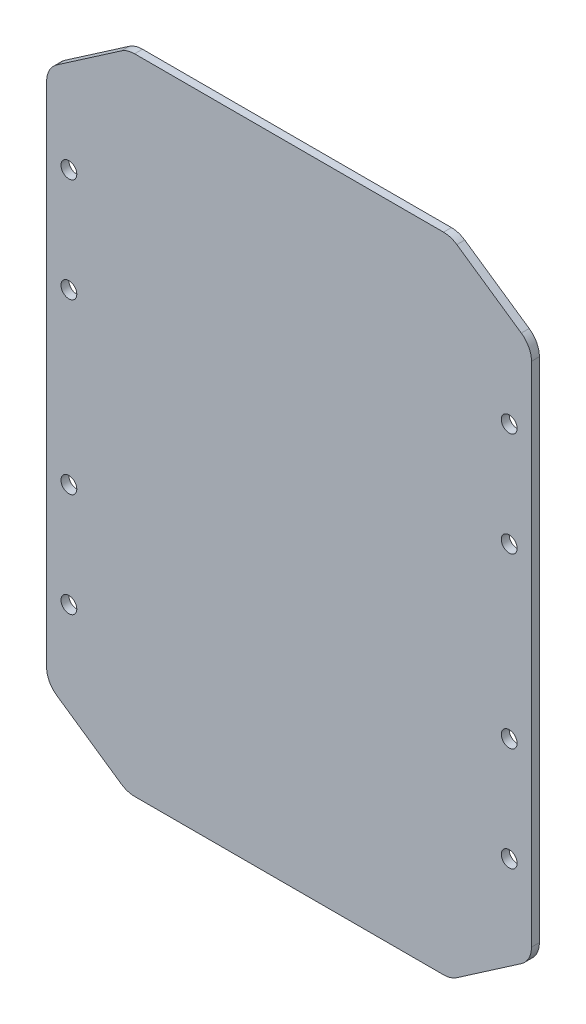
ISO-10303-21;
HEADER;
FILE_DESCRIPTION(('STEP AP214'),'2;1');
FILE_NAME('part.step','',(''),(''),'','','');
FILE_SCHEMA(('AUTOMOTIVE_DESIGN { 1 0 10303 214 1 1 1 1 }'));
ENDSEC;
DATA;
#1=APPLICATION_CONTEXT('core data for automotive mechanical design processes');
#2=APPLICATION_PROTOCOL_DEFINITION('international standard','automotive_design',2000,#1);
#3=PRODUCT_CONTEXT('',#1,'mechanical');
#4=PRODUCT('Part','Part','',(#3));
#5=PRODUCT_RELATED_PRODUCT_CATEGORY('part','',(#4));
#6=PRODUCT_DEFINITION_FORMATION('','',#4);
#7=PRODUCT_DEFINITION_CONTEXT('part definition',#1,'design');
#8=PRODUCT_DEFINITION('design','',#6,#7);
#9=PRODUCT_DEFINITION_SHAPE('','',#8);
#10=(LENGTH_UNIT() NAMED_UNIT(*) SI_UNIT(.MILLI.,.METRE.));
#11=(NAMED_UNIT(*) PLANE_ANGLE_UNIT() SI_UNIT($,.RADIAN.));
#12=(NAMED_UNIT(*) SI_UNIT($,.STERADIAN.) SOLID_ANGLE_UNIT());
#13=UNCERTAINTY_MEASURE_WITH_UNIT(LENGTH_MEASURE(1.E-05),#10,'distance_accuracy_value','');
#14=(GEOMETRIC_REPRESENTATION_CONTEXT(3) GLOBAL_UNCERTAINTY_ASSIGNED_CONTEXT((#13)) GLOBAL_UNIT_ASSIGNED_CONTEXT((#10,
#11,#12)) REPRESENTATION_CONTEXT('',''));
#15=CARTESIAN_POINT('',(0.,0.,0.));
#16=DIRECTION('',(0.,0.,1.));
#17=DIRECTION('',(1.,0.,0.));
#18=AXIS2_PLACEMENT_3D('',#15,#16,#17);
#19=CARTESIAN_POINT('',(40.8711702146889,-59.3739251689317,1.6));
#20=DIRECTION('',(-0.567014792889111,0.82370760870889,0.));
#21=DIRECTION('',(-0.82370760870889,-0.567014792889111,0.));
#22=AXIS2_PLACEMENT_3D('',#19,#20,#21);
#23=PLANE('',#22);
#24=DIRECTION('',(0.82370760870889,0.567014792889111,0.));
#25=VECTOR('',#24,1.);
#26=CARTESIAN_POINT('',(40.8711702146889,-59.3739251689317,0.));
#27=LINE('',#26,#25);
#28=CARTESIAN_POINT('',(33.9146020251458,-64.1626111413673,0.));
#29=VERTEX_POINT('',#28);
#30=CARTESIAN_POINT('',(46.9433202662233,-55.194045236465,0.));
#31=VERTEX_POINT('',#30);
#32=EDGE_CURVE('E206',#29,#31,#27,.T.);
#33=ORIENTED_EDGE('',*,*,#32,.T.);
#34=DIRECTION('',(0.,0.,-1.));
#35=VECTOR('',#34,1.);
#36=CARTESIAN_POINT('',(46.9433202662233,-55.194045236465,1.6));
#37=LINE('',#36,#35);
#38=CARTESIAN_POINT('',(46.9433202662233,-55.194045236465,1.6));
#39=VERTEX_POINT('',#38);
#40=EDGE_CURVE('E11',#39,#31,#37,.T.);
#41=ORIENTED_EDGE('',*,*,#40,.F.);
#42=DIRECTION('',(0.82370760870889,0.567014792889111,0.));
#43=VECTOR('',#42,1.);
#44=CARTESIAN_POINT('',(40.8711702146889,-59.3739251689317,1.6));
#45=LINE('',#44,#43);
#46=CARTESIAN_POINT('',(33.9146020251458,-64.1626111413673,1.6));
#47=VERTEX_POINT('',#46);
#48=EDGE_CURVE('E294',#47,#39,#45,.T.);
#49=ORIENTED_EDGE('',*,*,#48,.F.);
#50=DIRECTION('',(0.,0.,-1.));
#51=VECTOR('',#50,1.);
#52=CARTESIAN_POINT('',(33.9146020251458,-64.1626111413673,1.6));
#53=LINE('',#52,#51);
#54=EDGE_CURVE('E181',#47,#29,#53,.T.);
#55=ORIENTED_EDGE('',*,*,#54,.T.);
#56=EDGE_LOOP('',(#33,#41,#49,#55));
#57=FACE_BOUND('',#56,.T.);
#58=ADVANCED_FACE('F35',(#57),#23,.F.);
#59=CARTESIAN_POINT('',(44.25,-51.2814340950978,1.6));
#60=DIRECTION('',(0.,0.,-1.));
#61=DIRECTION('',(-1.,0.,0.));
#62=AXIS2_PLACEMENT_3D('',#59,#60,#61);
#63=CYLINDRICAL_SURFACE('',#62,4.75);
#64=CARTESIAN_POINT('',(44.25,-51.2814340950978,0.));
#65=DIRECTION('',(0.,0.,1.));
#66=DIRECTION('',(1.,0.,0.));
#67=AXIS2_PLACEMENT_3D('',#64,#65,#66);
#68=CIRCLE('',#67,4.75);
#69=CARTESIAN_POINT('',(49.,-51.2814340950978,0.));
#70=VERTEX_POINT('',#69);
#71=EDGE_CURVE('E209',#31,#70,#68,.T.);
#72=ORIENTED_EDGE('',*,*,#71,.T.);
#73=DIRECTION('',(0.,0.,-1.));
#74=VECTOR('',#73,1.);
#75=CARTESIAN_POINT('',(49.,-51.2814340950978,1.6));
#76=LINE('',#75,#74);
#77=CARTESIAN_POINT('',(49.,-51.2814340950978,1.6));
#78=VERTEX_POINT('',#77);
#79=EDGE_CURVE('E44',#78,#70,#76,.T.);
#80=ORIENTED_EDGE('',*,*,#79,.F.);
#81=CARTESIAN_POINT('',(44.25,-51.2814340950978,1.6));
#82=DIRECTION('',(0.,0.,1.));
#83=DIRECTION('',(1.,0.,0.));
#84=AXIS2_PLACEMENT_3D('',#81,#82,#83);
#85=CIRCLE('',#84,4.75);
#86=EDGE_CURVE('E118',#39,#78,#85,.T.);
#87=ORIENTED_EDGE('',*,*,#86,.F.);
#88=ORIENTED_EDGE('',*,*,#40,.T.);
#89=EDGE_LOOP('',(#72,#80,#87,#88));
#90=FACE_BOUND('',#89,.T.);
#91=ADVANCED_FACE('F277',(#90),#63,.T.);
#92=CARTESIAN_POINT('',(49.,0.,1.6));
#93=DIRECTION('',(1.,0.,0.));
#94=DIRECTION('',(0.,1.,0.));
#95=AXIS2_PLACEMENT_3D('',#92,#93,#94);
#96=PLANE('',#95);
#97=DIRECTION('',(0.,-1.,0.));
#98=VECTOR('',#97,1.);
#99=CARTESIAN_POINT('',(49.,0.,0.));
#100=LINE('',#99,#98);
#101=CARTESIAN_POINT('',(49.,51.2814340950978,0.));
#102=VERTEX_POINT('',#101);
#103=EDGE_CURVE('E212',#102,#70,#100,.T.);
#104=ORIENTED_EDGE('',*,*,#103,.F.);
#105=DIRECTION('',(0.,0.,-1.));
#106=VECTOR('',#105,1.);
#107=CARTESIAN_POINT('',(49.,51.2814340950978,1.6));
#108=LINE('',#107,#106);
#109=CARTESIAN_POINT('',(49.,51.2814340950978,1.6));
#110=VERTEX_POINT('',#109);
#111=EDGE_CURVE('E270',#110,#102,#108,.T.);
#112=ORIENTED_EDGE('',*,*,#111,.F.);
#113=DIRECTION('',(0.,-1.,0.));
#114=VECTOR('',#113,1.);
#115=CARTESIAN_POINT('',(49.,0.,1.6));
#116=LINE('',#115,#114);
#117=EDGE_CURVE('E276',#110,#78,#116,.T.);
#118=ORIENTED_EDGE('',*,*,#117,.T.);
#119=ORIENTED_EDGE('',*,*,#79,.T.);
#120=EDGE_LOOP('',(#104,#112,#118,#119));
#121=FACE_BOUND('',#120,.T.);
#122=ADVANCED_FACE('F274',(#121),#96,.T.);
#123=CARTESIAN_POINT('',(44.25,51.2814340950978,1.6));
#124=DIRECTION('',(0.,0.,-1.));
#125=DIRECTION('',(-1.,0.,0.));
#126=AXIS2_PLACEMENT_3D('',#123,#124,#125);
#127=CYLINDRICAL_SURFACE('',#126,4.75);
#128=CARTESIAN_POINT('',(44.25,51.2814340950978,0.));
#129=DIRECTION('',(0.,0.,1.));
#130=DIRECTION('',(1.,0.,0.));
#131=AXIS2_PLACEMENT_3D('',#128,#129,#130);
#132=CIRCLE('',#131,4.75);
#133=CARTESIAN_POINT('',(46.9433202662233,55.194045236465,0.));
#134=VERTEX_POINT('',#133);
#135=EDGE_CURVE('E215',#134,#102,#132,.F.);
#136=ORIENTED_EDGE('',*,*,#135,.F.);
#137=DIRECTION('',(0.,0.,-1.));
#138=VECTOR('',#137,1.);
#139=CARTESIAN_POINT('',(46.9433202662233,55.194045236465,1.6));
#140=LINE('',#139,#138);
#141=CARTESIAN_POINT('',(46.9433202662233,55.194045236465,1.6));
#142=VERTEX_POINT('',#141);
#143=EDGE_CURVE('E268',#142,#134,#140,.T.);
#144=ORIENTED_EDGE('',*,*,#143,.F.);
#145=CARTESIAN_POINT('',(44.25,51.2814340950978,1.6));
#146=DIRECTION('',(0.,0.,1.));
#147=DIRECTION('',(1.,0.,0.));
#148=AXIS2_PLACEMENT_3D('',#145,#146,#147);
#149=CIRCLE('',#148,4.75);
#150=EDGE_CURVE('E288',#142,#110,#149,.F.);
#151=ORIENTED_EDGE('',*,*,#150,.T.);
#152=ORIENTED_EDGE('',*,*,#111,.T.);
#153=EDGE_LOOP('',(#136,#144,#151,#152));
#154=FACE_BOUND('',#153,.T.);
#155=ADVANCED_FACE('F285',(#154),#127,.T.);
#156=CARTESIAN_POINT('',(40.8711702146889,59.3739251689317,1.6));
#157=DIRECTION('',(0.567014792889111,0.82370760870889,0.));
#158=DIRECTION('',(-0.82370760870889,0.567014792889111,0.));
#159=AXIS2_PLACEMENT_3D('',#156,#157,#158);
#160=PLANE('',#159);
#161=DIRECTION('',(0.82370760870889,-0.567014792889111,0.));
#162=VECTOR('',#161,1.);
#163=CARTESIAN_POINT('',(40.8711702146889,59.3739251689317,0.));
#164=LINE('',#163,#162);
#165=CARTESIAN_POINT('',(33.9146020251458,64.1626111413673,0.));
#166=VERTEX_POINT('',#165);
#167=EDGE_CURVE('E218',#166,#134,#164,.T.);
#168=ORIENTED_EDGE('',*,*,#167,.F.);
#169=DIRECTION('',(0.,0.,-1.));
#170=VECTOR('',#169,1.);
#171=CARTESIAN_POINT('',(33.9146020251458,64.1626111413673,1.6));
#172=LINE('',#171,#170);
#173=CARTESIAN_POINT('',(33.9146020251458,64.1626111413673,1.6));
#174=VERTEX_POINT('',#173);
#175=EDGE_CURVE('E266',#174,#166,#172,.T.);
#176=ORIENTED_EDGE('',*,*,#175,.F.);
#177=DIRECTION('',(0.82370760870889,-0.567014792889111,0.));
#178=VECTOR('',#177,1.);
#179=CARTESIAN_POINT('',(40.8711702146889,59.3739251689317,1.6));
#180=LINE('',#179,#178);
#181=EDGE_CURVE('E292',#174,#142,#180,.T.);
#182=ORIENTED_EDGE('',*,*,#181,.T.);
#183=ORIENTED_EDGE('',*,*,#143,.T.);
#184=EDGE_LOOP('',(#168,#176,#182,#183));
#185=FACE_BOUND('',#184,.T.);
#186=ADVANCED_FACE('F548',(#185),#160,.T.);
#187=CARTESIAN_POINT('',(31.2212817589226,60.25,1.6));
#188=DIRECTION('',(0.,0.,-1.));
#189=DIRECTION('',(-1.,0.,0.));
#190=AXIS2_PLACEMENT_3D('',#187,#188,#189);
#191=CYLINDRICAL_SURFACE('',#190,4.75);
#192=CARTESIAN_POINT('',(31.2212817589226,60.25,0.));
#193=DIRECTION('',(0.,0.,1.));
#194=DIRECTION('',(1.,0.,0.));
#195=AXIS2_PLACEMENT_3D('',#192,#193,#194);
#196=CIRCLE('',#195,4.75);
#197=CARTESIAN_POINT('',(31.2212817589226,65.,0.));
#198=VERTEX_POINT('',#197);
#199=EDGE_CURVE('E221',#198,#166,#196,.F.);
#200=ORIENTED_EDGE('',*,*,#199,.F.);
#201=DIRECTION('',(0.,0.,-1.));
#202=VECTOR('',#201,1.);
#203=CARTESIAN_POINT('',(31.2212817589226,65.,1.6));
#204=LINE('',#203,#202);
#205=CARTESIAN_POINT('',(31.2212817589226,65.,1.6));
#206=VERTEX_POINT('',#205);
#207=EDGE_CURVE('E264',#206,#198,#204,.T.);
#208=ORIENTED_EDGE('',*,*,#207,.F.);
#209=CARTESIAN_POINT('',(31.2212817589226,60.25,1.6));
#210=DIRECTION('',(0.,0.,1.));
#211=DIRECTION('',(1.,0.,0.));
#212=AXIS2_PLACEMENT_3D('',#209,#210,#211);
#213=CIRCLE('',#212,4.75);
#214=EDGE_CURVE('E299',#206,#174,#213,.F.);
#215=ORIENTED_EDGE('',*,*,#214,.T.);
#216=ORIENTED_EDGE('',*,*,#175,.T.);
#217=EDGE_LOOP('',(#200,#208,#215,#216));
#218=FACE_BOUND('',#217,.T.);
#219=ADVANCED_FACE('F538',(#218),#191,.T.);
#220=CARTESIAN_POINT('',(0.,65.,1.6));
#221=DIRECTION('',(0.,1.,0.));
#222=DIRECTION('',(0.,0.,1.));
#223=AXIS2_PLACEMENT_3D('',#220,#221,#222);
#224=PLANE('',#223);
#225=DIRECTION('',(1.,0.,0.));
#226=VECTOR('',#225,1.);
#227=CARTESIAN_POINT('',(0.,65.,0.));
#228=LINE('',#227,#226);
#229=CARTESIAN_POINT('',(-31.2212817589226,65.,0.));
#230=VERTEX_POINT('',#229);
#231=EDGE_CURVE('E224',#230,#198,#228,.T.);
#232=ORIENTED_EDGE('',*,*,#231,.F.);
#233=DIRECTION('',(0.,0.,-1.));
#234=VECTOR('',#233,1.);
#235=CARTESIAN_POINT('',(-31.2212817589226,65.,1.6));
#236=LINE('',#235,#234);
#237=CARTESIAN_POINT('',(-31.2212817589226,65.,1.6));
#238=VERTEX_POINT('',#237);
#239=EDGE_CURVE('E262',#238,#230,#236,.T.);
#240=ORIENTED_EDGE('',*,*,#239,.F.);
#241=DIRECTION('',(1.,0.,0.));
#242=VECTOR('',#241,1.);
#243=CARTESIAN_POINT('',(0.,65.,1.6));
#244=LINE('',#243,#242);
#245=EDGE_CURVE('E302',#238,#206,#244,.T.);
#246=ORIENTED_EDGE('',*,*,#245,.T.);
#247=ORIENTED_EDGE('',*,*,#207,.T.);
#248=EDGE_LOOP('',(#232,#240,#246,#247));
#249=FACE_BOUND('',#248,.T.);
#250=ADVANCED_FACE('F528',(#249),#224,.T.);
#251=CARTESIAN_POINT('',(-31.2212817589226,60.25,1.6));
#252=DIRECTION('',(0.,0.,-1.));
#253=DIRECTION('',(-1.,0.,0.));
#254=AXIS2_PLACEMENT_3D('',#251,#252,#253);
#255=CYLINDRICAL_SURFACE('',#254,4.75);
#256=CARTESIAN_POINT('',(-31.2212817589226,60.25,0.));
#257=DIRECTION('',(0.,0.,1.));
#258=DIRECTION('',(1.,0.,0.));
#259=AXIS2_PLACEMENT_3D('',#256,#257,#258);
#260=CIRCLE('',#259,4.75);
#261=CARTESIAN_POINT('',(-33.9146020251458,64.1626111413673,0.));
#262=VERTEX_POINT('',#261);
#263=EDGE_CURVE('E227',#230,#262,#260,.T.);
#264=ORIENTED_EDGE('',*,*,#263,.T.);
#265=DIRECTION('',(0.,0.,-1.));
#266=VECTOR('',#265,1.);
#267=CARTESIAN_POINT('',(-33.9146020251458,64.1626111413673,1.6));
#268=LINE('',#267,#266);
#269=CARTESIAN_POINT('',(-33.9146020251458,64.1626111413673,1.6));
#270=VERTEX_POINT('',#269);
#271=EDGE_CURVE('E259',#270,#262,#268,.T.);
#272=ORIENTED_EDGE('',*,*,#271,.F.);
#273=CARTESIAN_POINT('',(-31.2212817589226,60.25,1.6));
#274=DIRECTION('',(0.,0.,1.));
#275=DIRECTION('',(1.,0.,0.));
#276=AXIS2_PLACEMENT_3D('',#273,#274,#275);
#277=CIRCLE('',#276,4.75);
#278=EDGE_CURVE('E305',#238,#270,#277,.T.);
#279=ORIENTED_EDGE('',*,*,#278,.F.);
#280=ORIENTED_EDGE('',*,*,#239,.T.);
#281=EDGE_LOOP('',(#264,#272,#279,#280));
#282=FACE_BOUND('',#281,.T.);
#283=ADVANCED_FACE('F518',(#282),#255,.T.);
#284=CARTESIAN_POINT('',(-40.8711702146889,59.3739251689317,1.6));
#285=DIRECTION('',(0.567014792889111,-0.82370760870889,0.));
#286=DIRECTION('',(0.82370760870889,0.567014792889111,0.));
#287=AXIS2_PLACEMENT_3D('',#284,#285,#286);
#288=PLANE('',#287);
#289=DIRECTION('',(-0.82370760870889,-0.567014792889111,0.));
#290=VECTOR('',#289,1.);
#291=CARTESIAN_POINT('',(-40.8711702146889,59.3739251689317,0.));
#292=LINE('',#291,#290);
#293=CARTESIAN_POINT('',(-46.9433202662233,55.194045236465,0.));
#294=VERTEX_POINT('',#293);
#295=EDGE_CURVE('E229',#262,#294,#292,.T.);
#296=ORIENTED_EDGE('',*,*,#295,.T.);
#297=DIRECTION('',(0.,0.,-1.));
#298=VECTOR('',#297,1.);
#299=CARTESIAN_POINT('',(-46.9433202662233,55.194045236465,1.6));
#300=LINE('',#299,#298);
#301=CARTESIAN_POINT('',(-46.9433202662233,55.194045236465,1.6));
#302=VERTEX_POINT('',#301);
#303=EDGE_CURVE('E256',#302,#294,#300,.T.);
#304=ORIENTED_EDGE('',*,*,#303,.F.);
#305=DIRECTION('',(-0.82370760870889,-0.567014792889111,0.));
#306=VECTOR('',#305,1.);
#307=CARTESIAN_POINT('',(-40.8711702146889,59.3739251689317,1.6));
#308=LINE('',#307,#306);
#309=EDGE_CURVE('E307',#270,#302,#308,.T.);
#310=ORIENTED_EDGE('',*,*,#309,.F.);
#311=ORIENTED_EDGE('',*,*,#271,.T.);
#312=EDGE_LOOP('',(#296,#304,#310,#311));
#313=FACE_BOUND('',#312,.T.);
#314=ADVANCED_FACE('F508',(#313),#288,.F.);
#315=CARTESIAN_POINT('',(-44.25,51.2814340950978,1.6));
#316=DIRECTION('',(0.,0.,-1.));
#317=DIRECTION('',(-1.,0.,0.));
#318=AXIS2_PLACEMENT_3D('',#315,#316,#317);
#319=CYLINDRICAL_SURFACE('',#318,4.75);
#320=CARTESIAN_POINT('',(-44.25,51.2814340950978,0.));
#321=DIRECTION('',(0.,0.,1.));
#322=DIRECTION('',(1.,0.,0.));
#323=AXIS2_PLACEMENT_3D('',#320,#321,#322);
#324=CIRCLE('',#323,4.75);
#325=CARTESIAN_POINT('',(-49.,51.2814340950978,0.));
#326=VERTEX_POINT('',#325);
#327=EDGE_CURVE('E231',#294,#326,#324,.T.);
#328=ORIENTED_EDGE('',*,*,#327,.T.);
#329=DIRECTION('',(0.,0.,-1.));
#330=VECTOR('',#329,1.);
#331=CARTESIAN_POINT('',(-49.,51.2814340950978,1.6));
#332=LINE('',#331,#330);
#333=CARTESIAN_POINT('',(-49.,51.2814340950978,1.6));
#334=VERTEX_POINT('',#333);
#335=EDGE_CURVE('E253',#334,#326,#332,.T.);
#336=ORIENTED_EDGE('',*,*,#335,.F.);
#337=CARTESIAN_POINT('',(-44.25,51.2814340950978,1.6));
#338=DIRECTION('',(0.,0.,1.));
#339=DIRECTION('',(1.,0.,0.));
#340=AXIS2_PLACEMENT_3D('',#337,#338,#339);
#341=CIRCLE('',#340,4.75);
#342=EDGE_CURVE('E309',#302,#334,#341,.T.);
#343=ORIENTED_EDGE('',*,*,#342,.F.);
#344=ORIENTED_EDGE('',*,*,#303,.T.);
#345=EDGE_LOOP('',(#328,#336,#343,#344));
#346=FACE_BOUND('',#345,.T.);
#347=ADVANCED_FACE('F498',(#346),#319,.T.);
#348=CARTESIAN_POINT('',(-49.,0.,1.6));
#349=DIRECTION('',(1.,0.,0.));
#350=DIRECTION('',(0.,0.,-1.));
#351=AXIS2_PLACEMENT_3D('',#348,#349,#350);
#352=PLANE('',#351);
#353=DIRECTION('',(0.,-1.,0.));
#354=VECTOR('',#353,1.);
#355=CARTESIAN_POINT('',(-49.,0.,0.));
#356=LINE('',#355,#354);
#357=CARTESIAN_POINT('',(-49.,-51.2814340950978,0.));
#358=VERTEX_POINT('',#357);
#359=EDGE_CURVE('E233',#326,#358,#356,.T.);
#360=ORIENTED_EDGE('',*,*,#359,.T.);
#361=DIRECTION('',(0.,0.,-1.));
#362=VECTOR('',#361,1.);
#363=CARTESIAN_POINT('',(-49.,-51.2814340950978,1.6));
#364=LINE('',#363,#362);
#365=CARTESIAN_POINT('',(-49.,-51.2814340950978,1.6));
#366=VERTEX_POINT('',#365);
#367=EDGE_CURVE('E251',#366,#358,#364,.T.);
#368=ORIENTED_EDGE('',*,*,#367,.F.);
#369=DIRECTION('',(0.,-1.,0.));
#370=VECTOR('',#369,1.);
#371=CARTESIAN_POINT('',(-49.,0.,1.6));
#372=LINE('',#371,#370);
#373=EDGE_CURVE('E311',#334,#366,#372,.T.);
#374=ORIENTED_EDGE('',*,*,#373,.F.);
#375=ORIENTED_EDGE('',*,*,#335,.T.);
#376=EDGE_LOOP('',(#360,#368,#374,#375));
#377=FACE_BOUND('',#376,.T.);
#378=ADVANCED_FACE('F489',(#377),#352,.F.);
#379=CARTESIAN_POINT('',(-44.25,-51.2814340950978,1.6));
#380=DIRECTION('',(0.,0.,-1.));
#381=DIRECTION('',(-1.,0.,0.));
#382=AXIS2_PLACEMENT_3D('',#379,#380,#381);
#383=CYLINDRICAL_SURFACE('',#382,4.75);
#384=CARTESIAN_POINT('',(-44.25,-51.2814340950978,0.));
#385=DIRECTION('',(0.,0.,1.));
#386=DIRECTION('',(1.,0.,0.));
#387=AXIS2_PLACEMENT_3D('',#384,#385,#386);
#388=CIRCLE('',#387,4.75);
#389=CARTESIAN_POINT('',(-46.9433202662233,-55.194045236465,0.));
#390=VERTEX_POINT('',#389);
#391=EDGE_CURVE('E236',#390,#358,#388,.F.);
#392=ORIENTED_EDGE('',*,*,#391,.F.);
#393=DIRECTION('',(0.,0.,-1.));
#394=VECTOR('',#393,1.);
#395=CARTESIAN_POINT('',(-46.9433202662233,-55.194045236465,1.6));
#396=LINE('',#395,#394);
#397=CARTESIAN_POINT('',(-46.9433202662233,-55.194045236465,1.6));
#398=VERTEX_POINT('',#397);
#399=EDGE_CURVE('E249',#398,#390,#396,.T.);
#400=ORIENTED_EDGE('',*,*,#399,.F.);
#401=CARTESIAN_POINT('',(-44.25,-51.2814340950978,1.6));
#402=DIRECTION('',(0.,0.,1.));
#403=DIRECTION('',(1.,0.,0.));
#404=AXIS2_PLACEMENT_3D('',#401,#402,#403);
#405=CIRCLE('',#404,4.75);
#406=EDGE_CURVE('E176',#398,#366,#405,.F.);
#407=ORIENTED_EDGE('',*,*,#406,.T.);
#408=ORIENTED_EDGE('',*,*,#367,.T.);
#409=EDGE_LOOP('',(#392,#400,#407,#408));
#410=FACE_BOUND('',#409,.T.);
#411=ADVANCED_FACE('F315',(#410),#383,.T.);
#412=CARTESIAN_POINT('',(-40.8711702146889,-59.3739251689317,1.6));
#413=DIRECTION('',(-0.567014792889111,-0.82370760870889,0.));
#414=DIRECTION('',(0.82370760870889,-0.567014792889111,0.));
#415=AXIS2_PLACEMENT_3D('',#412,#413,#414);
#416=PLANE('',#415);
#417=DIRECTION('',(-0.82370760870889,0.567014792889111,0.));
#418=VECTOR('',#417,1.);
#419=CARTESIAN_POINT('',(-40.8711702146889,-59.3739251689317,0.));
#420=LINE('',#419,#418);
#421=CARTESIAN_POINT('',(-33.9146020251458,-64.1626111413673,0.));
#422=VERTEX_POINT('',#421);
#423=EDGE_CURVE('E239',#422,#390,#420,.T.);
#424=ORIENTED_EDGE('',*,*,#423,.F.);
#425=DIRECTION('',(0.,0.,-1.));
#426=VECTOR('',#425,1.);
#427=CARTESIAN_POINT('',(-33.9146020251458,-64.1626111413673,1.6));
#428=LINE('',#427,#426);
#429=CARTESIAN_POINT('',(-33.9146020251458,-64.1626111413673,1.6));
#430=VERTEX_POINT('',#429);
#431=EDGE_CURVE('E164',#430,#422,#428,.T.);
#432=ORIENTED_EDGE('',*,*,#431,.F.);
#433=DIRECTION('',(-0.82370760870889,0.567014792889111,0.));
#434=VECTOR('',#433,1.);
#435=CARTESIAN_POINT('',(-40.8711702146889,-59.3739251689317,1.6));
#436=LINE('',#435,#434);
#437=EDGE_CURVE('E174',#430,#398,#436,.T.);
#438=ORIENTED_EDGE('',*,*,#437,.T.);
#439=ORIENTED_EDGE('',*,*,#399,.T.);
#440=EDGE_LOOP('',(#424,#432,#438,#439));
#441=FACE_BOUND('',#440,.T.);
#442=ADVANCED_FACE('F320',(#441),#416,.T.);
#443=CARTESIAN_POINT('',(-31.2212817589226,-60.25,1.6));
#444=DIRECTION('',(0.,0.,-1.));
#445=DIRECTION('',(-1.,0.,0.));
#446=AXIS2_PLACEMENT_3D('',#443,#444,#445);
#447=CYLINDRICAL_SURFACE('',#446,4.75);
#448=CARTESIAN_POINT('',(-31.2212817589226,-60.25,0.));
#449=DIRECTION('',(0.,0.,1.));
#450=DIRECTION('',(1.,0.,0.));
#451=AXIS2_PLACEMENT_3D('',#448,#449,#450);
#452=CIRCLE('',#451,4.75);
#453=CARTESIAN_POINT('',(-31.2212817589226,-65.,0.));
#454=VERTEX_POINT('',#453);
#455=EDGE_CURVE('E163',#454,#422,#452,.F.);
#456=ORIENTED_EDGE('',*,*,#455,.F.);
#457=DIRECTION('',(0.,0.,-1.));
#458=VECTOR('',#457,1.);
#459=CARTESIAN_POINT('',(-31.2212817589226,-65.,1.6));
#460=LINE('',#459,#458);
#461=CARTESIAN_POINT('',(-31.2212817589226,-65.,1.6));
#462=VERTEX_POINT('',#461);
#463=EDGE_CURVE('E157',#462,#454,#460,.T.);
#464=ORIENTED_EDGE('',*,*,#463,.F.);
#465=CARTESIAN_POINT('',(-31.2212817589226,-60.25,1.6));
#466=DIRECTION('',(0.,0.,1.));
#467=DIRECTION('',(1.,0.,0.));
#468=AXIS2_PLACEMENT_3D('',#465,#466,#467);
#469=CIRCLE('',#468,4.75);
#470=EDGE_CURVE('E161',#462,#430,#469,.F.);
#471=ORIENTED_EDGE('',*,*,#470,.T.);
#472=ORIENTED_EDGE('',*,*,#431,.T.);
#473=EDGE_LOOP('',(#456,#464,#471,#472));
#474=FACE_BOUND('',#473,.T.);
#475=ADVANCED_FACE('F159',(#474),#447,.T.);
#476=CARTESIAN_POINT('',(0.,-65.,1.6));
#477=DIRECTION('',(0.,1.,0.));
#478=DIRECTION('',(0.,0.,1.));
#479=AXIS2_PLACEMENT_3D('',#476,#477,#478);
#480=PLANE('',#479);
#481=DIRECTION('',(1.,0.,0.));
#482=VECTOR('',#481,1.);
#483=CARTESIAN_POINT('',(0.,-65.,0.));
#484=LINE('',#483,#482);
#485=CARTESIAN_POINT('',(31.2212817589226,-65.,0.));
#486=VERTEX_POINT('',#485);
#487=EDGE_CURVE('E104',#454,#486,#484,.T.);
#488=ORIENTED_EDGE('',*,*,#487,.T.);
#489=DIRECTION('',(0.,0.,-1.));
#490=VECTOR('',#489,1.);
#491=CARTESIAN_POINT('',(31.2212817589226,-65.,1.6));
#492=LINE('',#491,#490);
#493=CARTESIAN_POINT('',(31.2212817589226,-65.,1.6));
#494=VERTEX_POINT('',#493);
#495=EDGE_CURVE('E165',#494,#486,#492,.T.);
#496=ORIENTED_EDGE('',*,*,#495,.F.);
#497=DIRECTION('',(1.,0.,0.));
#498=VECTOR('',#497,1.);
#499=CARTESIAN_POINT('',(0.,-65.,1.6));
#500=LINE('',#499,#498);
#501=EDGE_CURVE('E167',#462,#494,#500,.T.);
#502=ORIENTED_EDGE('',*,*,#501,.F.);
#503=ORIENTED_EDGE('',*,*,#463,.T.);
#504=EDGE_LOOP('',(#488,#496,#502,#503));
#505=FACE_BOUND('',#504,.T.);
#506=ADVANCED_FACE('F168',(#505),#480,.F.);
#507=CARTESIAN_POINT('',(44.5,38.0565096031517,1.6));
#508=DIRECTION('',(0.,0.,-1.));
#509=DIRECTION('',(-1.,0.,0.));
#510=AXIS2_PLACEMENT_3D('',#507,#508,#509);
#511=CYLINDRICAL_SURFACE('',#510,1.6);
#512=CARTESIAN_POINT('',(44.5,38.0565096031517,1.6));
#513=DIRECTION('',(0.,0.,1.));
#514=DIRECTION('',(1.,0.,0.));
#515=AXIS2_PLACEMENT_3D('',#512,#513,#514);
#516=CIRCLE('',#515,1.6);
#517=CARTESIAN_POINT('',(46.1,38.0565096031517,1.6));
#518=VERTEX_POINT('',#517);
#519=EDGE_CURVE('E627',#518,#518,#516,.F.);
#520=ORIENTED_EDGE('',*,*,#519,.F.);
#521=EDGE_LOOP('',(#520));
#522=FACE_BOUND('',#521,.T.);
#523=CARTESIAN_POINT('',(44.5,38.0565096031517,0.));
#524=DIRECTION('',(0.,0.,1.));
#525=DIRECTION('',(1.,0.,0.));
#526=AXIS2_PLACEMENT_3D('',#523,#524,#525);
#527=CIRCLE('',#526,1.6);
#528=CARTESIAN_POINT('',(46.1,38.0565096031517,0.));
#529=VERTEX_POINT('',#528);
#530=EDGE_CURVE('E203',#529,#529,#527,.F.);
#531=ORIENTED_EDGE('',*,*,#530,.T.);
#532=EDGE_LOOP('',(#531));
#533=FACE_BOUND('',#532,.T.);
#534=ADVANCED_FACE('F344',(#522,#533),#511,.F.);
#535=CARTESIAN_POINT('',(44.5,-38.0565096031517,1.6));
#536=DIRECTION('',(0.,0.,-1.));
#537=DIRECTION('',(-1.,0.,0.));
#538=AXIS2_PLACEMENT_3D('',#535,#536,#537);
#539=CYLINDRICAL_SURFACE('',#538,1.6);
#540=CARTESIAN_POINT('',(44.5,-38.0565096031517,1.6));
#541=DIRECTION('',(0.,0.,1.));
#542=DIRECTION('',(1.,0.,0.));
#543=AXIS2_PLACEMENT_3D('',#540,#541,#542);
#544=CIRCLE('',#543,1.6);
#545=CARTESIAN_POINT('',(46.1,-38.0565096031517,1.6));
#546=VERTEX_POINT('',#545);
#547=EDGE_CURVE('E624',#546,#546,#544,.T.);
#548=ORIENTED_EDGE('',*,*,#547,.T.);
#549=EDGE_LOOP('',(#548));
#550=FACE_BOUND('',#549,.T.);
#551=CARTESIAN_POINT('',(44.5,-38.0565096031517,0.));
#552=DIRECTION('',(0.,0.,1.));
#553=DIRECTION('',(1.,0.,0.));
#554=AXIS2_PLACEMENT_3D('',#551,#552,#553);
#555=CIRCLE('',#554,1.6);
#556=CARTESIAN_POINT('',(46.1,-38.0565096031517,0.));
#557=VERTEX_POINT('',#556);
#558=EDGE_CURVE('E200',#557,#557,#555,.T.);
#559=ORIENTED_EDGE('',*,*,#558,.F.);
#560=EDGE_LOOP('',(#559));
#561=FACE_BOUND('',#560,.T.);
#562=ADVANCED_FACE('F347',(#550,#561),#539,.F.);
#563=CARTESIAN_POINT('',(44.5,-17.0565096031518,1.6));
#564=DIRECTION('',(0.,0.,-1.));
#565=DIRECTION('',(-1.,0.,0.));
#566=AXIS2_PLACEMENT_3D('',#563,#564,#565);
#567=CYLINDRICAL_SURFACE('',#566,1.6);
#568=CARTESIAN_POINT('',(44.5,-17.0565096031518,1.6));
#569=DIRECTION('',(0.,0.,1.));
#570=DIRECTION('',(1.,0.,0.));
#571=AXIS2_PLACEMENT_3D('',#568,#569,#570);
#572=CIRCLE('',#571,1.6);
#573=CARTESIAN_POINT('',(46.1,-17.0565096031518,1.6));
#574=VERTEX_POINT('',#573);
#575=EDGE_CURVE('E621',#574,#574,#572,.T.);
#576=ORIENTED_EDGE('',*,*,#575,.T.);
#577=EDGE_LOOP('',(#576));
#578=FACE_BOUND('',#577,.T.);
#579=CARTESIAN_POINT('',(44.5,-17.0565096031518,0.));
#580=DIRECTION('',(0.,0.,1.));
#581=DIRECTION('',(1.,0.,0.));
#582=AXIS2_PLACEMENT_3D('',#579,#580,#581);
#583=CIRCLE('',#582,1.6);
#584=CARTESIAN_POINT('',(46.1,-17.0565096031518,0.));
#585=VERTEX_POINT('',#584);
#586=EDGE_CURVE('E197',#585,#585,#583,.T.);
#587=ORIENTED_EDGE('',*,*,#586,.F.);
#588=EDGE_LOOP('',(#587));
#589=FACE_BOUND('',#588,.T.);
#590=ADVANCED_FACE('F351',(#578,#589),#567,.F.);
#591=CARTESIAN_POINT('',(-44.5,-38.0565096031517,1.6));
#592=DIRECTION('',(0.,0.,-1.));
#593=DIRECTION('',(-1.,0.,0.));
#594=AXIS2_PLACEMENT_3D('',#591,#592,#593);
#595=CYLINDRICAL_SURFACE('',#594,1.6);
#596=CARTESIAN_POINT('',(-44.5,-38.0565096031517,1.6));
#597=DIRECTION('',(0.,0.,1.));
#598=DIRECTION('',(1.,0.,0.));
#599=AXIS2_PLACEMENT_3D('',#596,#597,#598);
#600=CIRCLE('',#599,1.6);
#601=CARTESIAN_POINT('',(-42.9,-38.0565096031517,1.6));
#602=VERTEX_POINT('',#601);
#603=EDGE_CURVE('E618',#602,#602,#600,.F.);
#604=ORIENTED_EDGE('',*,*,#603,.F.);
#605=EDGE_LOOP('',(#604));
#606=FACE_BOUND('',#605,.T.);
#607=CARTESIAN_POINT('',(-44.5,-38.0565096031517,0.));
#608=DIRECTION('',(0.,0.,1.));
#609=DIRECTION('',(1.,0.,0.));
#610=AXIS2_PLACEMENT_3D('',#607,#608,#609);
#611=CIRCLE('',#610,1.6);
#612=CARTESIAN_POINT('',(-42.9,-38.0565096031517,0.));
#613=VERTEX_POINT('',#612);
#614=EDGE_CURVE('E194',#613,#613,#611,.F.);
#615=ORIENTED_EDGE('',*,*,#614,.T.);
#616=EDGE_LOOP('',(#615));
#617=FACE_BOUND('',#616,.T.);
#618=ADVANCED_FACE('F355',(#606,#617),#595,.F.);
#619=CARTESIAN_POINT('',(-44.5,38.0565096031517,1.6));
#620=DIRECTION('',(0.,0.,-1.));
#621=DIRECTION('',(-1.,0.,0.));
#622=AXIS2_PLACEMENT_3D('',#619,#620,#621);
#623=CYLINDRICAL_SURFACE('',#622,1.6);
#624=CARTESIAN_POINT('',(-44.5,38.0565096031517,1.6));
#625=DIRECTION('',(0.,0.,1.));
#626=DIRECTION('',(1.,0.,0.));
#627=AXIS2_PLACEMENT_3D('',#624,#625,#626);
#628=CIRCLE('',#627,1.6);
#629=CARTESIAN_POINT('',(-42.9,38.0565096031517,1.6));
#630=VERTEX_POINT('',#629);
#631=EDGE_CURVE('E611',#630,#630,#628,.T.);
#632=ORIENTED_EDGE('',*,*,#631,.T.);
#633=EDGE_LOOP('',(#632));
#634=FACE_BOUND('',#633,.T.);
#635=CARTESIAN_POINT('',(-44.5,38.0565096031517,0.));
#636=DIRECTION('',(0.,0.,1.));
#637=DIRECTION('',(1.,0.,0.));
#638=AXIS2_PLACEMENT_3D('',#635,#636,#637);
#639=CIRCLE('',#638,1.6);
#640=CARTESIAN_POINT('',(-42.9,38.0565096031517,0.));
#641=VERTEX_POINT('',#640);
#642=EDGE_CURVE('E191',#641,#641,#639,.T.);
#643=ORIENTED_EDGE('',*,*,#642,.F.);
#644=EDGE_LOOP('',(#643));
#645=FACE_BOUND('',#644,.T.);
#646=ADVANCED_FACE('F359',(#634,#645),#623,.F.);
#647=CARTESIAN_POINT('',(-44.5,17.0565096031518,1.6));
#648=DIRECTION('',(0.,0.,-1.));
#649=DIRECTION('',(-1.,0.,0.));
#650=AXIS2_PLACEMENT_3D('',#647,#648,#649);
#651=CYLINDRICAL_SURFACE('',#650,1.6);
#652=CARTESIAN_POINT('',(-44.5,17.0565096031518,1.6));
#653=DIRECTION('',(0.,0.,1.));
#654=DIRECTION('',(1.,0.,0.));
#655=AXIS2_PLACEMENT_3D('',#652,#653,#654);
#656=CIRCLE('',#655,1.6);
#657=CARTESIAN_POINT('',(-42.9,17.0565096031518,1.6));
#658=VERTEX_POINT('',#657);
#659=EDGE_CURVE('E608',#658,#658,#656,.T.);
#660=ORIENTED_EDGE('',*,*,#659,.T.);
#661=EDGE_LOOP('',(#660));
#662=FACE_BOUND('',#661,.T.);
#663=CARTESIAN_POINT('',(-44.5,17.0565096031518,0.));
#664=DIRECTION('',(0.,0.,1.));
#665=DIRECTION('',(1.,0.,0.));
#666=AXIS2_PLACEMENT_3D('',#663,#664,#665);
#667=CIRCLE('',#666,1.6);
#668=CARTESIAN_POINT('',(-42.9,17.0565096031518,0.));
#669=VERTEX_POINT('',#668);
#670=EDGE_CURVE('E188',#669,#669,#667,.T.);
#671=ORIENTED_EDGE('',*,*,#670,.F.);
#672=EDGE_LOOP('',(#671));
#673=FACE_BOUND('',#672,.T.);
#674=ADVANCED_FACE('F363',(#662,#673),#651,.F.);
#675=CARTESIAN_POINT('',(-44.5,-17.0565096031518,1.6));
#676=DIRECTION('',(0.,0.,-1.));
#677=DIRECTION('',(-1.,0.,0.));
#678=AXIS2_PLACEMENT_3D('',#675,#676,#677);
#679=CYLINDRICAL_SURFACE('',#678,1.6);
#680=CARTESIAN_POINT('',(-44.5,-17.0565096031518,1.6));
#681=DIRECTION('',(0.,0.,1.));
#682=DIRECTION('',(1.,0.,0.));
#683=AXIS2_PLACEMENT_3D('',#680,#681,#682);
#684=CIRCLE('',#683,1.6);
#685=CARTESIAN_POINT('',(-42.9,-17.0565096031518,1.6));
#686=VERTEX_POINT('',#685);
#687=EDGE_CURVE('E374',#686,#686,#684,.F.);
#688=ORIENTED_EDGE('',*,*,#687,.F.);
#689=EDGE_LOOP('',(#688));
#690=FACE_BOUND('',#689,.T.);
#691=CARTESIAN_POINT('',(-44.5,-17.0565096031518,0.));
#692=DIRECTION('',(0.,0.,1.));
#693=DIRECTION('',(1.,0.,0.));
#694=AXIS2_PLACEMENT_3D('',#691,#692,#693);
#695=CIRCLE('',#694,1.6);
#696=CARTESIAN_POINT('',(-42.9,-17.0565096031518,0.));
#697=VERTEX_POINT('',#696);
#698=EDGE_CURVE('E185',#697,#697,#695,.F.);
#699=ORIENTED_EDGE('',*,*,#698,.T.);
#700=EDGE_LOOP('',(#699));
#701=FACE_BOUND('',#700,.T.);
#702=ADVANCED_FACE('F332',(#690,#701),#679,.F.);
#703=CARTESIAN_POINT('',(44.5,17.0565096031518,1.6));
#704=DIRECTION('',(0.,0.,-1.));
#705=DIRECTION('',(-1.,0.,0.));
#706=AXIS2_PLACEMENT_3D('',#703,#704,#705);
#707=CYLINDRICAL_SURFACE('',#706,1.6);
#708=CARTESIAN_POINT('',(44.5,17.0565096031518,1.6));
#709=DIRECTION('',(0.,0.,1.));
#710=DIRECTION('',(1.,0.,0.));
#711=AXIS2_PLACEMENT_3D('',#708,#709,#710);
#712=CIRCLE('',#711,1.6);
#713=CARTESIAN_POINT('',(46.1,17.0565096031518,1.6));
#714=VERTEX_POINT('',#713);
#715=EDGE_CURVE('E245',#714,#714,#712,.F.);
#716=ORIENTED_EDGE('',*,*,#715,.F.);
#717=EDGE_LOOP('',(#716));
#718=FACE_BOUND('',#717,.T.);
#719=CARTESIAN_POINT('',(44.5,17.0565096031518,0.));
#720=DIRECTION('',(0.,0.,1.));
#721=DIRECTION('',(1.,0.,0.));
#722=AXIS2_PLACEMENT_3D('',#719,#720,#721);
#723=CIRCLE('',#722,1.6);
#724=CARTESIAN_POINT('',(46.1,17.0565096031518,0.));
#725=VERTEX_POINT('',#724);
#726=EDGE_CURVE('E182',#725,#725,#723,.F.);
#727=ORIENTED_EDGE('',*,*,#726,.T.);
#728=EDGE_LOOP('',(#727));
#729=FACE_BOUND('',#728,.T.);
#730=ADVANCED_FACE('F37',(#718,#729),#707,.F.);
#731=CARTESIAN_POINT('',(31.2212817589226,-60.25,1.6));
#732=DIRECTION('',(0.,0.,-1.));
#733=DIRECTION('',(-1.,0.,0.));
#734=AXIS2_PLACEMENT_3D('',#731,#732,#733);
#735=CYLINDRICAL_SURFACE('',#734,4.75);
#736=CARTESIAN_POINT('',(31.2212817589226,-60.25,0.));
#737=DIRECTION('',(0.,0.,1.));
#738=DIRECTION('',(1.,0.,0.));
#739=AXIS2_PLACEMENT_3D('',#736,#737,#738);
#740=CIRCLE('',#739,4.75);
#741=EDGE_CURVE('E110',#486,#29,#740,.T.);
#742=ORIENTED_EDGE('',*,*,#741,.T.);
#743=ORIENTED_EDGE('',*,*,#54,.F.);
#744=CARTESIAN_POINT('',(31.2212817589226,-60.25,1.6));
#745=DIRECTION('',(0.,0.,1.));
#746=DIRECTION('',(1.,0.,0.));
#747=AXIS2_PLACEMENT_3D('',#744,#745,#746);
#748=CIRCLE('',#747,4.75);
#749=EDGE_CURVE('E52',#494,#47,#748,.T.);
#750=ORIENTED_EDGE('',*,*,#749,.F.);
#751=ORIENTED_EDGE('',*,*,#495,.T.);
#752=EDGE_LOOP('',(#742,#743,#750,#751));
#753=FACE_BOUND('',#752,.T.);
#754=ADVANCED_FACE('F323',(#753),#735,.T.);
#755=CARTESIAN_POINT('',(0.,0.,1.6));
#756=DIRECTION('',(0.,0.,1.));
#757=DIRECTION('',(1.,0.,0.));
#758=AXIS2_PLACEMENT_3D('',#755,#756,#757);
#759=PLANE('',#758);
#760=ORIENTED_EDGE('',*,*,#715,.T.);
#761=EDGE_LOOP('',(#760));
#762=FACE_BOUND('',#761,.T.);
#763=ORIENTED_EDGE('',*,*,#687,.T.);
#764=EDGE_LOOP('',(#763));
#765=FACE_BOUND('',#764,.T.);
#766=ORIENTED_EDGE('',*,*,#659,.F.);
#767=EDGE_LOOP('',(#766));
#768=FACE_BOUND('',#767,.T.);
#769=ORIENTED_EDGE('',*,*,#631,.F.);
#770=EDGE_LOOP('',(#769));
#771=FACE_BOUND('',#770,.T.);
#772=ORIENTED_EDGE('',*,*,#603,.T.);
#773=EDGE_LOOP('',(#772));
#774=FACE_BOUND('',#773,.T.);
#775=ORIENTED_EDGE('',*,*,#575,.F.);
#776=EDGE_LOOP('',(#775));
#777=FACE_BOUND('',#776,.T.);
#778=ORIENTED_EDGE('',*,*,#547,.F.);
#779=EDGE_LOOP('',(#778));
#780=FACE_BOUND('',#779,.T.);
#781=ORIENTED_EDGE('',*,*,#519,.T.);
#782=EDGE_LOOP('',(#781));
#783=FACE_BOUND('',#782,.T.);
#784=ORIENTED_EDGE('',*,*,#48,.T.);
#785=ORIENTED_EDGE('',*,*,#86,.T.);
#786=ORIENTED_EDGE('',*,*,#117,.F.);
#787=ORIENTED_EDGE('',*,*,#150,.F.);
#788=ORIENTED_EDGE('',*,*,#181,.F.);
#789=ORIENTED_EDGE('',*,*,#214,.F.);
#790=ORIENTED_EDGE('',*,*,#245,.F.);
#791=ORIENTED_EDGE('',*,*,#278,.T.);
#792=ORIENTED_EDGE('',*,*,#309,.T.);
#793=ORIENTED_EDGE('',*,*,#342,.T.);
#794=ORIENTED_EDGE('',*,*,#373,.T.);
#795=ORIENTED_EDGE('',*,*,#406,.F.);
#796=ORIENTED_EDGE('',*,*,#437,.F.);
#797=ORIENTED_EDGE('',*,*,#470,.F.);
#798=ORIENTED_EDGE('',*,*,#501,.T.);
#799=ORIENTED_EDGE('',*,*,#749,.T.);
#800=EDGE_LOOP('',(#784,#785,#786,#787,#788,#789,#790,#791,#792,#793,#794,#795,#796,#797,#798,#799));
#801=FACE_BOUND('',#800,.T.);
#802=ADVANCED_FACE('F171',(#762,#765,#768,#771,#774,#777,#780,#783,#801),#759,.T.);
#803=CARTESIAN_POINT('',(0.,0.,0.));
#804=DIRECTION('',(0.,0.,1.));
#805=DIRECTION('',(1.,0.,0.));
#806=AXIS2_PLACEMENT_3D('',#803,#804,#805);
#807=PLANE('',#806);
#808=ORIENTED_EDGE('',*,*,#726,.F.);
#809=EDGE_LOOP('',(#808));
#810=FACE_BOUND('',#809,.T.);
#811=ORIENTED_EDGE('',*,*,#698,.F.);
#812=EDGE_LOOP('',(#811));
#813=FACE_BOUND('',#812,.T.);
#814=ORIENTED_EDGE('',*,*,#670,.T.);
#815=EDGE_LOOP('',(#814));
#816=FACE_BOUND('',#815,.T.);
#817=ORIENTED_EDGE('',*,*,#642,.T.);
#818=EDGE_LOOP('',(#817));
#819=FACE_BOUND('',#818,.T.);
#820=ORIENTED_EDGE('',*,*,#614,.F.);
#821=EDGE_LOOP('',(#820));
#822=FACE_BOUND('',#821,.T.);
#823=ORIENTED_EDGE('',*,*,#586,.T.);
#824=EDGE_LOOP('',(#823));
#825=FACE_BOUND('',#824,.T.);
#826=ORIENTED_EDGE('',*,*,#558,.T.);
#827=EDGE_LOOP('',(#826));
#828=FACE_BOUND('',#827,.T.);
#829=ORIENTED_EDGE('',*,*,#530,.F.);
#830=EDGE_LOOP('',(#829));
#831=FACE_BOUND('',#830,.T.);
#832=ORIENTED_EDGE('',*,*,#32,.F.);
#833=ORIENTED_EDGE('',*,*,#741,.F.);
#834=ORIENTED_EDGE('',*,*,#487,.F.);
#835=ORIENTED_EDGE('',*,*,#455,.T.);
#836=ORIENTED_EDGE('',*,*,#423,.T.);
#837=ORIENTED_EDGE('',*,*,#391,.T.);
#838=ORIENTED_EDGE('',*,*,#359,.F.);
#839=ORIENTED_EDGE('',*,*,#327,.F.);
#840=ORIENTED_EDGE('',*,*,#295,.F.);
#841=ORIENTED_EDGE('',*,*,#263,.F.);
#842=ORIENTED_EDGE('',*,*,#231,.T.);
#843=ORIENTED_EDGE('',*,*,#199,.T.);
#844=ORIENTED_EDGE('',*,*,#167,.T.);
#845=ORIENTED_EDGE('',*,*,#135,.T.);
#846=ORIENTED_EDGE('',*,*,#103,.T.);
#847=ORIENTED_EDGE('',*,*,#71,.F.);
#848=EDGE_LOOP('',(#832,#833,#834,#835,#836,#837,#838,#839,#840,#841,#842,#843,#844,#845,#846,#847));
#849=FACE_BOUND('',#848,.T.);
#850=ADVANCED_FACE('F281',(#810,#813,#816,#819,#822,#825,#828,#831,#849),#807,.F.);
#851=CLOSED_SHELL('',(#58,#91,#122,#155,#186,#219,#250,#283,#314,#347,#378,#411,#442,#475,#506,
#534,#562,#590,#618,#646,#674,#702,#730,#754,#802,#850));
#852=MANIFOLD_SOLID_BREP('B2',#851);
#853=ADVANCED_BREP_SHAPE_REPRESENTATION('',(#18,#852),#14);
#854=SHAPE_DEFINITION_REPRESENTATION(#9,#853);
ENDSEC;
END-ISO-10303-21;
